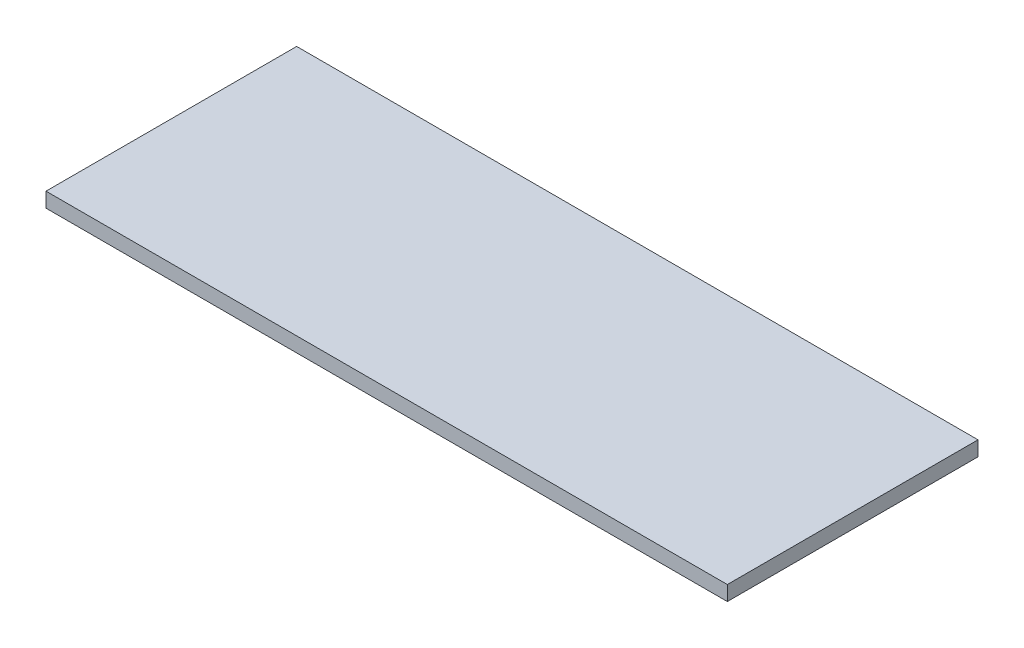
ISO-10303-21;
HEADER;
FILE_DESCRIPTION(('STEP AP214'),'2;1');
FILE_NAME('part.step','',(''),(''),'','','');
FILE_SCHEMA(('AUTOMOTIVE_DESIGN { 1 0 10303 214 1 1 1 1 }'));
ENDSEC;
DATA;
#1=APPLICATION_CONTEXT('core data for automotive mechanical design processes');
#2=APPLICATION_PROTOCOL_DEFINITION('international standard','automotive_design',2000,#1);
#3=PRODUCT_CONTEXT('',#1,'mechanical');
#4=PRODUCT('Part','Part','',(#3));
#5=PRODUCT_RELATED_PRODUCT_CATEGORY('part','',(#4));
#6=PRODUCT_DEFINITION_FORMATION('','',#4);
#7=PRODUCT_DEFINITION_CONTEXT('part definition',#1,'design');
#8=PRODUCT_DEFINITION('design','',#6,#7);
#9=PRODUCT_DEFINITION_SHAPE('','',#8);
#10=(LENGTH_UNIT() NAMED_UNIT(*) SI_UNIT(.MILLI.,.METRE.));
#11=(NAMED_UNIT(*) PLANE_ANGLE_UNIT() SI_UNIT($,.RADIAN.));
#12=(NAMED_UNIT(*) SI_UNIT($,.STERADIAN.) SOLID_ANGLE_UNIT());
#13=UNCERTAINTY_MEASURE_WITH_UNIT(LENGTH_MEASURE(1.E-05),#10,'distance_accuracy_value','');
#14=(GEOMETRIC_REPRESENTATION_CONTEXT(3) GLOBAL_UNCERTAINTY_ASSIGNED_CONTEXT((#13)) GLOBAL_UNIT_ASSIGNED_CONTEXT((#10,
#11,#12)) REPRESENTATION_CONTEXT('',''));
#15=CARTESIAN_POINT('',(0.,0.,0.));
#16=DIRECTION('',(0.,0.,1.));
#17=DIRECTION('',(1.,0.,0.));
#18=AXIS2_PLACEMENT_3D('',#15,#16,#17);
#19=CARTESIAN_POINT('',(0.,0.,0.));
#20=DIRECTION('',(0.,-1.,0.));
#21=DIRECTION('',(0.,0.,-1.));
#22=AXIS2_PLACEMENT_3D('',#19,#20,#21);
#23=PLANE('',#22);
#24=DIRECTION('',(0.,0.,1.));
#25=VECTOR('',#24,1.);
#26=CARTESIAN_POINT('',(-0.9049154,0.,0.864952));
#27=LINE('',#26,#25);
#28=CARTESIAN_POINT('',(-0.9049154,0.,-134.96));
#29=VERTEX_POINT('',#28);
#30=CARTESIAN_POINT('',(-0.9049154,0.,0.864952));
#31=VERTEX_POINT('',#30);
#32=EDGE_CURVE('E142',#29,#31,#27,.T.);
#33=ORIENTED_EDGE('',*,*,#32,.F.);
#34=DIRECTION('',(-1.,0.,0.));
#35=VECTOR('',#34,1.);
#36=CARTESIAN_POINT('',(-0.9049154,0.,-134.96));
#37=LINE('',#36,#35);
#38=CARTESIAN_POINT('',(368.284,0.,-134.96));
#39=VERTEX_POINT('',#38);
#40=EDGE_CURVE('E85',#39,#29,#37,.T.);
#41=ORIENTED_EDGE('',*,*,#40,.F.);
#42=DIRECTION('',(0.,0.,-1.));
#43=VECTOR('',#42,1.);
#44=CARTESIAN_POINT('',(368.284,0.,-134.96));
#45=LINE('',#44,#43);
#46=CARTESIAN_POINT('',(368.284,0.,0.864952));
#47=VERTEX_POINT('',#46);
#48=EDGE_CURVE('E165',#47,#39,#45,.T.);
#49=ORIENTED_EDGE('',*,*,#48,.F.);
#50=DIRECTION('',(1.,0.,0.));
#51=VECTOR('',#50,1.);
#52=CARTESIAN_POINT('',(368.284,0.,0.864952));
#53=LINE('',#52,#51);
#54=EDGE_CURVE('E147',#31,#47,#53,.T.);
#55=ORIENTED_EDGE('',*,*,#54,.F.);
#56=EDGE_LOOP('',(#33,#41,#49,#55));
#57=FACE_BOUND('',#56,.T.);
#58=DIRECTION('',(1.,0.,0.));
#59=VECTOR('',#58,1.);
#60=CARTESIAN_POINT('',(64.0950846,0.,-73.135048));
#61=LINE('',#60,#59);
#62=CARTESIAN_POINT('',(64.0950846,0.,-73.135048));
#63=VERTEX_POINT('',#62);
#64=CARTESIAN_POINT('',(82.0950846,0.,-73.135048));
#65=VERTEX_POINT('',#64);
#66=EDGE_CURVE('E287',#63,#65,#61,.T.);
#67=ORIENTED_EDGE('',*,*,#66,.F.);
#68=DIRECTION('',(0.,0.,-1.));
#69=VECTOR('',#68,1.);
#70=CARTESIAN_POINT('',(64.0950846,0.,-22.135048));
#71=LINE('',#70,#69);
#72=CARTESIAN_POINT('',(64.0950846,0.,-22.135048));
#73=VERTEX_POINT('',#72);
#74=EDGE_CURVE('E139',#73,#63,#71,.T.);
#75=ORIENTED_EDGE('',*,*,#74,.F.);
#76=DIRECTION('',(-1.,0.,0.));
#77=VECTOR('',#76,1.);
#78=CARTESIAN_POINT('',(64.0950846,0.,-22.135048));
#79=LINE('',#78,#77);
#80=CARTESIAN_POINT('',(82.0950846,0.,-22.135048));
#81=VERTEX_POINT('',#80);
#82=EDGE_CURVE('E135',#81,#73,#79,.T.);
#83=ORIENTED_EDGE('',*,*,#82,.F.);
#84=DIRECTION('',(0.,0.,1.));
#85=VECTOR('',#84,1.);
#86=CARTESIAN_POINT('',(82.0950846,0.,-22.135048));
#87=LINE('',#86,#85);
#88=EDGE_CURVE('E283',#65,#81,#87,.T.);
#89=ORIENTED_EDGE('',*,*,#88,.F.);
#90=EDGE_LOOP('',(#67,#75,#83,#89));
#91=FACE_BOUND('',#90,.T.);
#92=ADVANCED_FACE('F39',(#57,#91),#23,.T.);
#93=CARTESIAN_POINT('',(-0.9049154,8.,0.864952));
#94=DIRECTION('',(1.,0.,0.));
#95=DIRECTION('',(0.,0.,-1.));
#96=AXIS2_PLACEMENT_3D('',#93,#94,#95);
#97=PLANE('',#96);
#98=ORIENTED_EDGE('',*,*,#32,.T.);
#99=DIRECTION('',(0.,-1.,0.));
#100=VECTOR('',#99,1.);
#101=CARTESIAN_POINT('',(-0.9049154,8.,0.864952));
#102=LINE('',#101,#100);
#103=CARTESIAN_POINT('',(-0.9049154,8.,0.864952));
#104=VERTEX_POINT('',#103);
#105=EDGE_CURVE('E11',#104,#31,#102,.T.);
#106=ORIENTED_EDGE('',*,*,#105,.F.);
#107=DIRECTION('',(0.,0.,1.));
#108=VECTOR('',#107,1.);
#109=CARTESIAN_POINT('',(-0.9049154,8.,0.864952));
#110=LINE('',#109,#108);
#111=CARTESIAN_POINT('',(-0.9049154,8.,-134.96));
#112=VERTEX_POINT('',#111);
#113=EDGE_CURVE('E152',#112,#104,#110,.T.);
#114=ORIENTED_EDGE('',*,*,#113,.F.);
#115=DIRECTION('',(0.,-1.,0.));
#116=VECTOR('',#115,1.);
#117=CARTESIAN_POINT('',(-0.9049154,8.,-134.96));
#118=LINE('',#117,#116);
#119=EDGE_CURVE('E161',#112,#29,#118,.T.);
#120=ORIENTED_EDGE('',*,*,#119,.T.);
#121=EDGE_LOOP('',(#98,#106,#114,#120));
#122=FACE_BOUND('',#121,.T.);
#123=ADVANCED_FACE('F41',(#122),#97,.F.);
#124=CARTESIAN_POINT('',(368.284,8.,0.864952));
#125=DIRECTION('',(0.,0.,-1.));
#126=DIRECTION('',(-1.,0.,0.));
#127=AXIS2_PLACEMENT_3D('',#124,#125,#126);
#128=PLANE('',#127);
#129=ORIENTED_EDGE('',*,*,#54,.T.);
#130=DIRECTION('',(0.,-1.,0.));
#131=VECTOR('',#130,1.);
#132=CARTESIAN_POINT('',(368.284,8.,0.864952));
#133=LINE('',#132,#131);
#134=CARTESIAN_POINT('',(368.284,8.,0.864952));
#135=VERTEX_POINT('',#134);
#136=EDGE_CURVE('E48',#135,#47,#133,.T.);
#137=ORIENTED_EDGE('',*,*,#136,.F.);
#138=DIRECTION('',(1.,0.,0.));
#139=VECTOR('',#138,1.);
#140=CARTESIAN_POINT('',(368.284,8.,0.864952));
#141=LINE('',#140,#139);
#142=EDGE_CURVE('E92',#104,#135,#141,.T.);
#143=ORIENTED_EDGE('',*,*,#142,.F.);
#144=ORIENTED_EDGE('',*,*,#105,.T.);
#145=EDGE_LOOP('',(#129,#137,#143,#144));
#146=FACE_BOUND('',#145,.T.);
#147=ADVANCED_FACE('F196',(#146),#128,.F.);
#148=CARTESIAN_POINT('',(368.284,8.,-134.96));
#149=DIRECTION('',(-1.,0.,0.));
#150=DIRECTION('',(0.,0.,1.));
#151=AXIS2_PLACEMENT_3D('',#148,#149,#150);
#152=PLANE('',#151);
#153=ORIENTED_EDGE('',*,*,#48,.T.);
#154=DIRECTION('',(0.,-1.,0.));
#155=VECTOR('',#154,1.);
#156=CARTESIAN_POINT('',(368.284,8.,-134.96));
#157=LINE('',#156,#155);
#158=CARTESIAN_POINT('',(368.284,8.,-134.96));
#159=VERTEX_POINT('',#158);
#160=EDGE_CURVE('E172',#159,#39,#157,.T.);
#161=ORIENTED_EDGE('',*,*,#160,.F.);
#162=DIRECTION('',(0.,0.,-1.));
#163=VECTOR('',#162,1.);
#164=CARTESIAN_POINT('',(368.284,8.,-134.96));
#165=LINE('',#164,#163);
#166=EDGE_CURVE('E157',#135,#159,#165,.T.);
#167=ORIENTED_EDGE('',*,*,#166,.F.);
#168=ORIENTED_EDGE('',*,*,#136,.T.);
#169=EDGE_LOOP('',(#153,#161,#167,#168));
#170=FACE_BOUND('',#169,.T.);
#171=ADVANCED_FACE('F179',(#170),#152,.F.);
#172=CARTESIAN_POINT('',(-0.9049154,8.,-134.96));
#173=DIRECTION('',(0.,0.,1.));
#174=DIRECTION('',(1.,0.,0.));
#175=AXIS2_PLACEMENT_3D('',#172,#173,#174);
#176=PLANE('',#175);
#177=ORIENTED_EDGE('',*,*,#40,.T.);
#178=ORIENTED_EDGE('',*,*,#119,.F.);
#179=DIRECTION('',(-1.,0.,0.));
#180=VECTOR('',#179,1.);
#181=CARTESIAN_POINT('',(-0.9049154,8.,-134.96));
#182=LINE('',#181,#180);
#183=EDGE_CURVE('E64',#159,#112,#182,.T.);
#184=ORIENTED_EDGE('',*,*,#183,.F.);
#185=ORIENTED_EDGE('',*,*,#160,.T.);
#186=EDGE_LOOP('',(#177,#178,#184,#185));
#187=FACE_BOUND('',#186,.T.);
#188=ADVANCED_FACE('F187',(#187),#176,.F.);
#189=CARTESIAN_POINT('',(0.,8.,0.));
#190=DIRECTION('',(0.,-1.,0.));
#191=DIRECTION('',(0.,0.,-1.));
#192=AXIS2_PLACEMENT_3D('',#189,#190,#191);
#193=PLANE('',#192);
#194=ORIENTED_EDGE('',*,*,#113,.T.);
#195=ORIENTED_EDGE('',*,*,#142,.T.);
#196=ORIENTED_EDGE('',*,*,#166,.T.);
#197=ORIENTED_EDGE('',*,*,#183,.T.);
#198=EDGE_LOOP('',(#194,#195,#196,#197));
#199=FACE_BOUND('',#198,.T.);
#200=ADVANCED_FACE('F189',(#199),#193,.F.);
#201=CARTESIAN_POINT('',(64.0950846,-4.,-22.135048));
#202=DIRECTION('',(1.,0.,0.));
#203=DIRECTION('',(0.,0.,-1.));
#204=AXIS2_PLACEMENT_3D('',#201,#202,#203);
#205=PLANE('',#204);
#206=ORIENTED_EDGE('',*,*,#74,.T.);
#207=DIRECTION('',(0.,1.,0.));
#208=VECTOR('',#207,1.);
#209=CARTESIAN_POINT('',(64.0950846,-4.,-73.135048));
#210=LINE('',#209,#208);
#211=CARTESIAN_POINT('',(64.0950846,-4.,-73.135048));
#212=VERTEX_POINT('',#211);
#213=EDGE_CURVE('E118',#212,#63,#210,.T.);
#214=ORIENTED_EDGE('',*,*,#213,.F.);
#215=DIRECTION('',(0.,0.,-1.));
#216=VECTOR('',#215,1.);
#217=CARTESIAN_POINT('',(64.0950846,-4.,-22.135048));
#218=LINE('',#217,#216);
#219=CARTESIAN_POINT('',(64.0950846,-4.,-22.135048));
#220=VERTEX_POINT('',#219);
#221=EDGE_CURVE('E126',#220,#212,#218,.T.);
#222=ORIENTED_EDGE('',*,*,#221,.F.);
#223=DIRECTION('',(0.,1.,0.));
#224=VECTOR('',#223,1.);
#225=CARTESIAN_POINT('',(64.0950846,-4.,-22.135048));
#226=LINE('',#225,#224);
#227=EDGE_CURVE('E280',#220,#73,#226,.T.);
#228=ORIENTED_EDGE('',*,*,#227,.T.);
#229=EDGE_LOOP('',(#206,#214,#222,#228));
#230=FACE_BOUND('',#229,.T.);
#231=ADVANCED_FACE('F137',(#230),#205,.F.);
#232=CARTESIAN_POINT('',(64.0950846,-4.,-73.135048));
#233=DIRECTION('',(0.,0.,1.));
#234=DIRECTION('',(1.,0.,0.));
#235=AXIS2_PLACEMENT_3D('',#232,#233,#234);
#236=PLANE('',#235);
#237=ORIENTED_EDGE('',*,*,#66,.T.);
#238=DIRECTION('',(0.,1.,0.));
#239=VECTOR('',#238,1.);
#240=CARTESIAN_POINT('',(82.0950846,-4.,-73.135048));
#241=LINE('',#240,#239);
#242=CARTESIAN_POINT('',(82.0950846,-4.,-73.135048));
#243=VERTEX_POINT('',#242);
#244=EDGE_CURVE('E121',#243,#65,#241,.T.);
#245=ORIENTED_EDGE('',*,*,#244,.F.);
#246=DIRECTION('',(1.,0.,0.));
#247=VECTOR('',#246,1.);
#248=CARTESIAN_POINT('',(64.0950846,-4.,-73.135048));
#249=LINE('',#248,#247);
#250=EDGE_CURVE('E114',#212,#243,#249,.T.);
#251=ORIENTED_EDGE('',*,*,#250,.F.);
#252=ORIENTED_EDGE('',*,*,#213,.T.);
#253=EDGE_LOOP('',(#237,#245,#251,#252));
#254=FACE_BOUND('',#253,.T.);
#255=ADVANCED_FACE('F116',(#254),#236,.F.);
#256=CARTESIAN_POINT('',(82.0950846,-4.,-22.135048));
#257=DIRECTION('',(-1.,0.,0.));
#258=DIRECTION('',(0.,0.,1.));
#259=AXIS2_PLACEMENT_3D('',#256,#257,#258);
#260=PLANE('',#259);
#261=ORIENTED_EDGE('',*,*,#88,.T.);
#262=DIRECTION('',(0.,1.,0.));
#263=VECTOR('',#262,1.);
#264=CARTESIAN_POINT('',(82.0950846,-4.,-22.135048));
#265=LINE('',#264,#263);
#266=CARTESIAN_POINT('',(82.0950846,-4.,-22.135048));
#267=VERTEX_POINT('',#266);
#268=EDGE_CURVE('E55',#267,#81,#265,.T.);
#269=ORIENTED_EDGE('',*,*,#268,.F.);
#270=DIRECTION('',(0.,0.,1.));
#271=VECTOR('',#270,1.);
#272=CARTESIAN_POINT('',(82.0950846,-4.,-22.135048));
#273=LINE('',#272,#271);
#274=EDGE_CURVE('E125',#243,#267,#273,.T.);
#275=ORIENTED_EDGE('',*,*,#274,.F.);
#276=ORIENTED_EDGE('',*,*,#244,.T.);
#277=EDGE_LOOP('',(#261,#269,#275,#276));
#278=FACE_BOUND('',#277,.T.);
#279=ADVANCED_FACE('F208',(#278),#260,.F.);
#280=CARTESIAN_POINT('',(64.0950846,-4.,-22.135048));
#281=DIRECTION('',(0.,0.,-1.));
#282=DIRECTION('',(-1.,0.,0.));
#283=AXIS2_PLACEMENT_3D('',#280,#281,#282);
#284=PLANE('',#283);
#285=ORIENTED_EDGE('',*,*,#82,.T.);
#286=ORIENTED_EDGE('',*,*,#227,.F.);
#287=DIRECTION('',(-1.,0.,0.));
#288=VECTOR('',#287,1.);
#289=CARTESIAN_POINT('',(64.0950846,-4.,-22.135048));
#290=LINE('',#289,#288);
#291=EDGE_CURVE('E130',#267,#220,#290,.T.);
#292=ORIENTED_EDGE('',*,*,#291,.F.);
#293=ORIENTED_EDGE('',*,*,#268,.T.);
#294=EDGE_LOOP('',(#285,#286,#292,#293));
#295=FACE_BOUND('',#294,.T.);
#296=ADVANCED_FACE('F211',(#295),#284,.F.);
#297=CARTESIAN_POINT('',(0.,-4.,0.));
#298=DIRECTION('',(0.,-1.,0.));
#299=DIRECTION('',(0.,0.,-1.));
#300=AXIS2_PLACEMENT_3D('',#297,#298,#299);
#301=PLANE('',#300);
#302=ORIENTED_EDGE('',*,*,#221,.T.);
#303=ORIENTED_EDGE('',*,*,#250,.T.);
#304=ORIENTED_EDGE('',*,*,#274,.T.);
#305=ORIENTED_EDGE('',*,*,#291,.T.);
#306=EDGE_LOOP('',(#302,#303,#304,#305));
#307=FACE_BOUND('',#306,.T.);
#308=ADVANCED_FACE('F129',(#307),#301,.T.);
#309=CLOSED_SHELL('',(#92,#123,#147,#171,#188,#200,#231,#255,#279,#296,#308));
#310=MANIFOLD_SOLID_BREP('B2',#309);
#311=ADVANCED_BREP_SHAPE_REPRESENTATION('',(#18,#310),#14);
#312=SHAPE_DEFINITION_REPRESENTATION(#9,#311);
ENDSEC;
END-ISO-10303-21;
